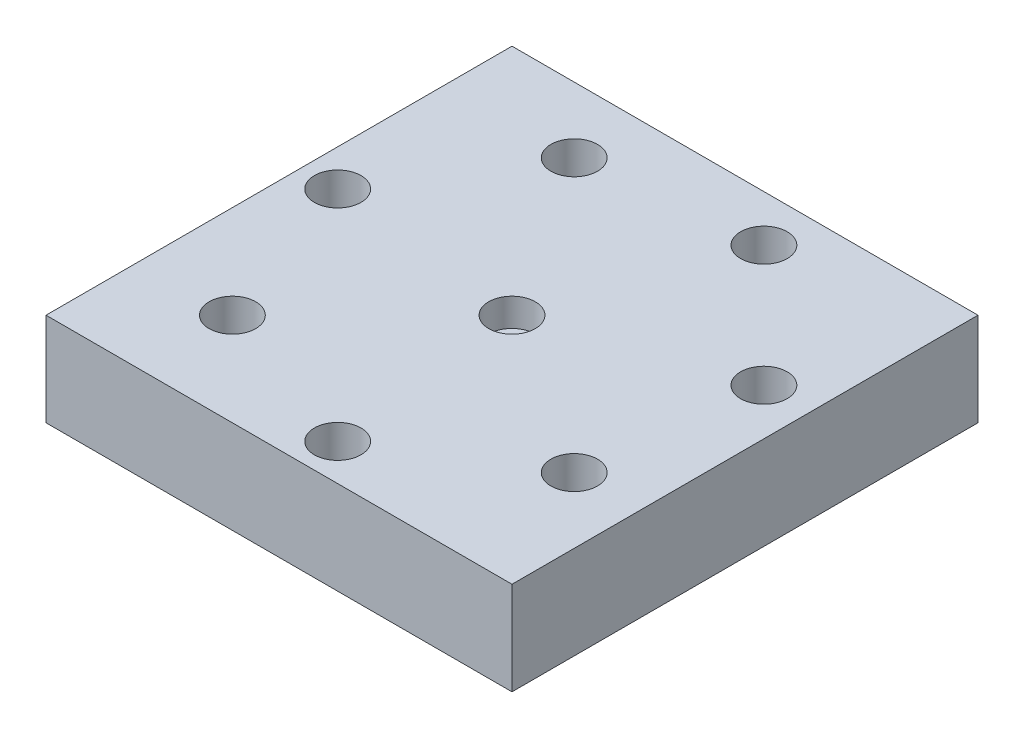
ISO-10303-21;
HEADER;
FILE_DESCRIPTION(('STEP AP214'),'2;1');
FILE_NAME('part.step','',(''),(''),'','','');
FILE_SCHEMA(('AUTOMOTIVE_DESIGN { 1 0 10303 214 1 1 1 1 }'));
ENDSEC;
DATA;
#1=APPLICATION_CONTEXT('core data for automotive mechanical design processes');
#2=APPLICATION_PROTOCOL_DEFINITION('international standard','automotive_design',2000,#1);
#3=PRODUCT_CONTEXT('',#1,'mechanical');
#4=PRODUCT('Part','Part','',(#3));
#5=PRODUCT_RELATED_PRODUCT_CATEGORY('part','',(#4));
#6=PRODUCT_DEFINITION_FORMATION('','',#4);
#7=PRODUCT_DEFINITION_CONTEXT('part definition',#1,'design');
#8=PRODUCT_DEFINITION('design','',#6,#7);
#9=PRODUCT_DEFINITION_SHAPE('','',#8);
#10=(LENGTH_UNIT() NAMED_UNIT(*) SI_UNIT(.MILLI.,.METRE.));
#11=(NAMED_UNIT(*) PLANE_ANGLE_UNIT() SI_UNIT($,.RADIAN.));
#12=(NAMED_UNIT(*) SI_UNIT($,.STERADIAN.) SOLID_ANGLE_UNIT());
#13=UNCERTAINTY_MEASURE_WITH_UNIT(LENGTH_MEASURE(1.E-05),#10,'distance_accuracy_value','');
#14=(GEOMETRIC_REPRESENTATION_CONTEXT(3) GLOBAL_UNCERTAINTY_ASSIGNED_CONTEXT((#13)) GLOBAL_UNIT_ASSIGNED_CONTEXT((#10,
#11,#12)) REPRESENTATION_CONTEXT('',''));
#15=CARTESIAN_POINT('',(0.,0.,0.));
#16=DIRECTION('',(0.,0.,1.));
#17=DIRECTION('',(1.,0.,0.));
#18=AXIS2_PLACEMENT_3D('',#15,#16,#17);
#19=CARTESIAN_POINT('',(0.,254.,0.));
#20=DIRECTION('',(0.,-1.,0.));
#21=DIRECTION('',(0.,0.,-1.));
#22=AXIS2_PLACEMENT_3D('',#19,#20,#21);
#23=PLANE('',#22);
#24=DIRECTION('',(0.,0.,-1.));
#25=VECTOR('',#24,1.);
#26=CARTESIAN_POINT('',(635.,254.,635.));
#27=LINE('',#26,#25);
#28=CARTESIAN_POINT('',(635.,254.,635.));
#29=VERTEX_POINT('',#28);
#30=CARTESIAN_POINT('',(635.,254.,-635.));
#31=VERTEX_POINT('',#30);
#32=EDGE_CURVE('E96',#29,#31,#27,.T.);
#33=ORIENTED_EDGE('',*,*,#32,.T.);
#34=DIRECTION('',(-1.,0.,0.));
#35=VECTOR('',#34,1.);
#36=CARTESIAN_POINT('',(-635.,254.,-635.));
#37=LINE('',#36,#35);
#38=CARTESIAN_POINT('',(-635.,254.,-635.));
#39=VERTEX_POINT('',#38);
#40=EDGE_CURVE('E91',#31,#39,#37,.T.);
#41=ORIENTED_EDGE('',*,*,#40,.T.);
#42=DIRECTION('',(0.,0.,1.));
#43=VECTOR('',#42,1.);
#44=CARTESIAN_POINT('',(-635.,254.,635.));
#45=LINE('',#44,#43);
#46=CARTESIAN_POINT('',(-635.,254.,635.));
#47=VERTEX_POINT('',#46);
#48=EDGE_CURVE('E94',#39,#47,#45,.T.);
#49=ORIENTED_EDGE('',*,*,#48,.T.);
#50=DIRECTION('',(1.,0.,0.));
#51=VECTOR('',#50,1.);
#52=CARTESIAN_POINT('',(-635.,254.,635.));
#53=LINE('',#52,#51);
#54=EDGE_CURVE('E61',#47,#29,#53,.T.);
#55=ORIENTED_EDGE('',*,*,#54,.T.);
#56=EDGE_LOOP('',(#33,#41,#49,#55));
#57=FACE_BOUND('',#56,.T.);
#58=CARTESIAN_POINT('',(-381.,254.,381.));
#59=DIRECTION('',(0.,1.,0.));
#60=DIRECTION('',(0.,0.,1.));
#61=AXIS2_PLACEMENT_3D('',#58,#59,#60);
#62=CIRCLE('',#61,63.5);
#63=CARTESIAN_POINT('',(-381.,254.,444.5));
#64=VERTEX_POINT('',#63);
#65=EDGE_CURVE('E111',#64,#64,#62,.T.);
#66=ORIENTED_EDGE('',*,*,#65,.F.);
#67=EDGE_LOOP('',(#66));
#68=FACE_BOUND('',#67,.T.);
#69=CARTESIAN_POINT('',(-535.427409328497,254.,-60.328180312143));
#70=DIRECTION('',(0.,1.,0.));
#71=DIRECTION('',(0.,0.,1.));
#72=AXIS2_PLACEMENT_3D('',#69,#70,#71);
#73=CIRCLE('',#72,63.5);
#74=CARTESIAN_POINT('',(-535.427409328497,254.,3.17181968785697));
#75=VERTEX_POINT('',#74);
#76=EDGE_CURVE('E127',#75,#75,#73,.T.);
#77=ORIENTED_EDGE('',*,*,#76,.F.);
#78=EDGE_LOOP('',(#77));
#79=FACE_BOUND('',#78,.T.);
#80=CARTESIAN_POINT('',(-286.667058703917,254.,-456.228010378632));
#81=DIRECTION('',(0.,1.,0.));
#82=DIRECTION('',(0.,0.,1.));
#83=AXIS2_PLACEMENT_3D('',#80,#81,#82);
#84=CIRCLE('',#83,63.5);
#85=CARTESIAN_POINT('',(-286.667058703917,254.,-392.728010378632));
#86=VERTEX_POINT('',#85);
#87=EDGE_CURVE('E141',#86,#86,#84,.T.);
#88=ORIENTED_EDGE('',*,*,#87,.F.);
#89=EDGE_LOOP('',(#88));
#90=FACE_BOUND('',#89,.T.);
#91=CARTESIAN_POINT('',(177.959434067035,254.,-508.57884327461));
#92=DIRECTION('',(0.,1.,0.));
#93=DIRECTION('',(0.,0.,1.));
#94=AXIS2_PLACEMENT_3D('',#91,#92,#93);
#95=CIRCLE('',#94,63.5);
#96=CARTESIAN_POINT('',(177.959434067035,254.,-445.07884327461));
#97=VERTEX_POINT('',#96);
#98=EDGE_CURVE('E142',#97,#97,#95,.T.);
#99=ORIENTED_EDGE('',*,*,#98,.F.);
#100=EDGE_LOOP('',(#99));
#101=FACE_BOUND('',#100,.T.);
#102=CARTESIAN_POINT('',(508.578843274613,254.,-177.959434067028));
#103=DIRECTION('',(0.,1.,0.));
#104=DIRECTION('',(0.,0.,1.));
#105=AXIS2_PLACEMENT_3D('',#102,#103,#104);
#106=CIRCLE('',#105,63.5);
#107=CARTESIAN_POINT('',(508.578843274613,254.,-114.459434067028));
#108=VERTEX_POINT('',#107);
#109=EDGE_CURVE('E164',#108,#108,#106,.T.);
#110=ORIENTED_EDGE('',*,*,#109,.F.);
#111=EDGE_LOOP('',(#110));
#112=FACE_BOUND('',#111,.T.);
#113=CARTESIAN_POINT('',(456.228010378628,254.,286.667058703923));
#114=DIRECTION('',(0.,1.,0.));
#115=DIRECTION('',(0.,0.,1.));
#116=AXIS2_PLACEMENT_3D('',#113,#114,#115);
#117=CIRCLE('',#116,63.5);
#118=CARTESIAN_POINT('',(456.228010378628,254.,350.167058703923));
#119=VERTEX_POINT('',#118);
#120=EDGE_CURVE('E173',#119,#119,#117,.T.);
#121=ORIENTED_EDGE('',*,*,#120,.F.);
#122=EDGE_LOOP('',(#121));
#123=FACE_BOUND('',#122,.T.);
#124=CARTESIAN_POINT('',(60.3281803121352,254.,535.427409328498));
#125=DIRECTION('',(0.,1.,0.));
#126=DIRECTION('',(0.,0.,1.));
#127=AXIS2_PLACEMENT_3D('',#124,#125,#126);
#128=CIRCLE('',#127,63.5);
#129=CARTESIAN_POINT('',(60.3281803121352,254.,598.927409328498));
#130=VERTEX_POINT('',#129);
#131=EDGE_CURVE('E174',#130,#130,#128,.T.);
#132=ORIENTED_EDGE('',*,*,#131,.F.);
#133=EDGE_LOOP('',(#132));
#134=FACE_BOUND('',#133,.T.);
#135=CARTESIAN_POINT('',(0.,254.,0.));
#136=DIRECTION('',(0.,1.,0.));
#137=DIRECTION('',(0.,0.,1.));
#138=AXIS2_PLACEMENT_3D('',#135,#136,#137);
#139=CIRCLE('',#138,63.5);
#140=CARTESIAN_POINT('',(0.,254.,63.5));
#141=VERTEX_POINT('',#140);
#142=EDGE_CURVE('E197',#141,#141,#139,.T.);
#143=ORIENTED_EDGE('',*,*,#142,.F.);
#144=EDGE_LOOP('',(#143));
#145=FACE_BOUND('',#144,.T.);
#146=ADVANCED_FACE('F44',(#57,#68,#79,#90,#101,#112,#123,#134,#145),#23,.F.);
#147=CARTESIAN_POINT('',(0.,0.,0.));
#148=DIRECTION('',(0.,-1.,0.));
#149=DIRECTION('',(0.,0.,-1.));
#150=AXIS2_PLACEMENT_3D('',#147,#148,#149);
#151=PLANE('',#150);
#152=CARTESIAN_POINT('',(0.,0.,0.));
#153=DIRECTION('',(0.,1.,0.));
#154=DIRECTION('',(0.,0.,1.));
#155=AXIS2_PLACEMENT_3D('',#152,#153,#154);
#156=CIRCLE('',#155,38.0999999999999);
#157=CARTESIAN_POINT('',(0.,0.,38.0999999999999));
#158=VERTEX_POINT('',#157);
#159=EDGE_CURVE('E207',#158,#158,#156,.T.);
#160=ORIENTED_EDGE('',*,*,#159,.T.);
#161=EDGE_LOOP('',(#160));
#162=FACE_BOUND('',#161,.T.);
#163=CARTESIAN_POINT('',(456.228010378628,0.,286.667058703923));
#164=DIRECTION('',(0.,1.,0.));
#165=DIRECTION('',(0.,0.,1.));
#166=AXIS2_PLACEMENT_3D('',#163,#164,#165);
#167=CIRCLE('',#166,63.5);
#168=CARTESIAN_POINT('',(456.228010378628,0.,350.167058703923));
#169=VERTEX_POINT('',#168);
#170=EDGE_CURVE('E169',#169,#169,#167,.T.);
#171=ORIENTED_EDGE('',*,*,#170,.T.);
#172=EDGE_LOOP('',(#171));
#173=FACE_BOUND('',#172,.T.);
#174=CARTESIAN_POINT('',(177.959434067035,0.,-508.57884327461));
#175=DIRECTION('',(0.,1.,0.));
#176=DIRECTION('',(0.,0.,1.));
#177=AXIS2_PLACEMENT_3D('',#174,#175,#176);
#178=CIRCLE('',#177,63.5);
#179=CARTESIAN_POINT('',(177.959434067035,0.,-445.07884327461));
#180=VERTEX_POINT('',#179);
#181=EDGE_CURVE('E159',#180,#180,#178,.T.);
#182=ORIENTED_EDGE('',*,*,#181,.T.);
#183=EDGE_LOOP('',(#182));
#184=FACE_BOUND('',#183,.T.);
#185=CARTESIAN_POINT('',(-535.427409328497,0.,-60.328180312143));
#186=DIRECTION('',(0.,1.,0.));
#187=DIRECTION('',(0.,0.,1.));
#188=AXIS2_PLACEMENT_3D('',#185,#186,#187);
#189=CIRCLE('',#188,63.5);
#190=CARTESIAN_POINT('',(-535.427409328497,0.,3.17181968785697));
#191=VERTEX_POINT('',#190);
#192=EDGE_CURVE('E147',#191,#191,#189,.T.);
#193=ORIENTED_EDGE('',*,*,#192,.T.);
#194=EDGE_LOOP('',(#193));
#195=FACE_BOUND('',#194,.T.);
#196=DIRECTION('',(0.,0.,-1.));
#197=VECTOR('',#196,1.);
#198=CARTESIAN_POINT('',(635.,0.,635.));
#199=LINE('',#198,#197);
#200=CARTESIAN_POINT('',(635.,0.,635.));
#201=VERTEX_POINT('',#200);
#202=CARTESIAN_POINT('',(635.,0.,-635.));
#203=VERTEX_POINT('',#202);
#204=EDGE_CURVE('E108',#201,#203,#199,.T.);
#205=ORIENTED_EDGE('',*,*,#204,.F.);
#206=DIRECTION('',(1.,0.,0.));
#207=VECTOR('',#206,1.);
#208=CARTESIAN_POINT('',(-635.,0.,635.));
#209=LINE('',#208,#207);
#210=CARTESIAN_POINT('',(-635.,0.,635.));
#211=VERTEX_POINT('',#210);
#212=EDGE_CURVE('E84',#211,#201,#209,.T.);
#213=ORIENTED_EDGE('',*,*,#212,.F.);
#214=DIRECTION('',(0.,0.,1.));
#215=VECTOR('',#214,1.);
#216=CARTESIAN_POINT('',(-635.,0.,635.));
#217=LINE('',#216,#215);
#218=CARTESIAN_POINT('',(-635.,0.,-635.));
#219=VERTEX_POINT('',#218);
#220=EDGE_CURVE('E78',#219,#211,#217,.T.);
#221=ORIENTED_EDGE('',*,*,#220,.F.);
#222=DIRECTION('',(-1.,0.,0.));
#223=VECTOR('',#222,1.);
#224=CARTESIAN_POINT('',(-635.,0.,-635.));
#225=LINE('',#224,#223);
#226=EDGE_CURVE('E100',#203,#219,#225,.T.);
#227=ORIENTED_EDGE('',*,*,#226,.F.);
#228=EDGE_LOOP('',(#205,#213,#221,#227));
#229=FACE_BOUND('',#228,.T.);
#230=CARTESIAN_POINT('',(-381.,0.,381.));
#231=DIRECTION('',(0.,1.,0.));
#232=DIRECTION('',(0.,0.,1.));
#233=AXIS2_PLACEMENT_3D('',#230,#231,#232);
#234=CIRCLE('',#233,63.5);
#235=CARTESIAN_POINT('',(-381.,0.,444.5));
#236=VERTEX_POINT('',#235);
#237=EDGE_CURVE('E123',#236,#236,#234,.T.);
#238=ORIENTED_EDGE('',*,*,#237,.T.);
#239=EDGE_LOOP('',(#238));
#240=FACE_BOUND('',#239,.T.);
#241=CARTESIAN_POINT('',(-286.667058703917,0.,-456.228010378632));
#242=DIRECTION('',(0.,1.,0.));
#243=DIRECTION('',(0.,0.,1.));
#244=AXIS2_PLACEMENT_3D('',#241,#242,#243);
#245=CIRCLE('',#244,63.5);
#246=CARTESIAN_POINT('',(-286.667058703917,0.,-392.728010378632));
#247=VERTEX_POINT('',#246);
#248=EDGE_CURVE('E136',#247,#247,#245,.T.);
#249=ORIENTED_EDGE('',*,*,#248,.T.);
#250=EDGE_LOOP('',(#249));
#251=FACE_BOUND('',#250,.T.);
#252=CARTESIAN_POINT('',(508.578843274613,0.,-177.959434067028));
#253=DIRECTION('',(0.,1.,0.));
#254=DIRECTION('',(0.,0.,1.));
#255=AXIS2_PLACEMENT_3D('',#252,#253,#254);
#256=CIRCLE('',#255,63.5);
#257=CARTESIAN_POINT('',(508.578843274613,0.,-114.459434067028));
#258=VERTEX_POINT('',#257);
#259=EDGE_CURVE('E160',#258,#258,#256,.T.);
#260=ORIENTED_EDGE('',*,*,#259,.T.);
#261=EDGE_LOOP('',(#260));
#262=FACE_BOUND('',#261,.T.);
#263=CARTESIAN_POINT('',(60.3281803121352,0.,535.427409328498));
#264=DIRECTION('',(0.,1.,0.));
#265=DIRECTION('',(0.,0.,1.));
#266=AXIS2_PLACEMENT_3D('',#263,#264,#265);
#267=CIRCLE('',#266,63.5);
#268=CARTESIAN_POINT('',(60.3281803121352,0.,598.927409328498));
#269=VERTEX_POINT('',#268);
#270=EDGE_CURVE('E209',#269,#269,#267,.T.);
#271=ORIENTED_EDGE('',*,*,#270,.T.);
#272=EDGE_LOOP('',(#271));
#273=FACE_BOUND('',#272,.T.);
#274=ADVANCED_FACE('F119',(#162,#173,#184,#195,#229,#240,#251,#262,#273),#151,.T.);
#275=CARTESIAN_POINT('',(635.,254.,635.));
#276=DIRECTION('',(-1.,0.,0.));
#277=DIRECTION('',(0.,0.,1.));
#278=AXIS2_PLACEMENT_3D('',#275,#276,#277);
#279=PLANE('',#278);
#280=ORIENTED_EDGE('',*,*,#204,.T.);
#281=DIRECTION('',(0.,-1.,0.));
#282=VECTOR('',#281,1.);
#283=CARTESIAN_POINT('',(635.,254.,-635.));
#284=LINE('',#283,#282);
#285=EDGE_CURVE('E12',#31,#203,#284,.T.);
#286=ORIENTED_EDGE('',*,*,#285,.F.);
#287=ORIENTED_EDGE('',*,*,#32,.F.);
#288=DIRECTION('',(0.,-1.,0.));
#289=VECTOR('',#288,1.);
#290=CARTESIAN_POINT('',(635.,254.,635.));
#291=LINE('',#290,#289);
#292=EDGE_CURVE('E104',#29,#201,#291,.T.);
#293=ORIENTED_EDGE('',*,*,#292,.T.);
#294=EDGE_LOOP('',(#280,#286,#287,#293));
#295=FACE_BOUND('',#294,.T.);
#296=ADVANCED_FACE('F46',(#295),#279,.F.);
#297=CARTESIAN_POINT('',(-635.,254.,-635.));
#298=DIRECTION('',(0.,0.,1.));
#299=DIRECTION('',(1.,0.,0.));
#300=AXIS2_PLACEMENT_3D('',#297,#298,#299);
#301=PLANE('',#300);
#302=ORIENTED_EDGE('',*,*,#226,.T.);
#303=DIRECTION('',(0.,-1.,0.));
#304=VECTOR('',#303,1.);
#305=CARTESIAN_POINT('',(-635.,254.,-635.));
#306=LINE('',#305,#304);
#307=EDGE_CURVE('E53',#39,#219,#306,.T.);
#308=ORIENTED_EDGE('',*,*,#307,.F.);
#309=ORIENTED_EDGE('',*,*,#40,.F.);
#310=ORIENTED_EDGE('',*,*,#285,.T.);
#311=EDGE_LOOP('',(#302,#308,#309,#310));
#312=FACE_BOUND('',#311,.T.);
#313=ADVANCED_FACE('F99',(#312),#301,.F.);
#314=CARTESIAN_POINT('',(-635.,254.,635.));
#315=DIRECTION('',(1.,0.,0.));
#316=DIRECTION('',(0.,0.,-1.));
#317=AXIS2_PLACEMENT_3D('',#314,#315,#316);
#318=PLANE('',#317);
#319=ORIENTED_EDGE('',*,*,#220,.T.);
#320=DIRECTION('',(0.,-1.,0.));
#321=VECTOR('',#320,1.);
#322=CARTESIAN_POINT('',(-635.,254.,635.));
#323=LINE('',#322,#321);
#324=EDGE_CURVE('E101',#47,#211,#323,.T.);
#325=ORIENTED_EDGE('',*,*,#324,.F.);
#326=ORIENTED_EDGE('',*,*,#48,.F.);
#327=ORIENTED_EDGE('',*,*,#307,.T.);
#328=EDGE_LOOP('',(#319,#325,#326,#327));
#329=FACE_BOUND('',#328,.T.);
#330=ADVANCED_FACE('F102',(#329),#318,.F.);
#331=CARTESIAN_POINT('',(-635.,254.,635.));
#332=DIRECTION('',(0.,0.,-1.));
#333=DIRECTION('',(-1.,0.,0.));
#334=AXIS2_PLACEMENT_3D('',#331,#332,#333);
#335=PLANE('',#334);
#336=ORIENTED_EDGE('',*,*,#212,.T.);
#337=ORIENTED_EDGE('',*,*,#292,.F.);
#338=ORIENTED_EDGE('',*,*,#54,.F.);
#339=ORIENTED_EDGE('',*,*,#324,.T.);
#340=EDGE_LOOP('',(#336,#337,#338,#339));
#341=FACE_BOUND('',#340,.T.);
#342=ADVANCED_FACE('F116',(#341),#335,.F.);
#343=CARTESIAN_POINT('',(-381.,254.,381.));
#344=DIRECTION('',(0.,-1.,0.));
#345=DIRECTION('',(0.,0.,-1.));
#346=AXIS2_PLACEMENT_3D('',#343,#344,#345);
#347=CYLINDRICAL_SURFACE('',#346,63.5);
#348=ORIENTED_EDGE('',*,*,#65,.T.);
#349=EDGE_LOOP('',(#348));
#350=FACE_BOUND('',#349,.T.);
#351=ORIENTED_EDGE('',*,*,#237,.F.);
#352=EDGE_LOOP('',(#351));
#353=FACE_BOUND('',#352,.T.);
#354=ADVANCED_FACE('F245',(#350,#353),#347,.F.);
#355=CARTESIAN_POINT('',(-535.427409328497,254.,-60.328180312143));
#356=DIRECTION('',(0.,-1.,0.));
#357=DIRECTION('',(0.,0.,-1.));
#358=AXIS2_PLACEMENT_3D('',#355,#356,#357);
#359=CYLINDRICAL_SURFACE('',#358,63.5);
#360=ORIENTED_EDGE('',*,*,#76,.T.);
#361=EDGE_LOOP('',(#360));
#362=FACE_BOUND('',#361,.T.);
#363=ORIENTED_EDGE('',*,*,#192,.F.);
#364=EDGE_LOOP('',(#363));
#365=FACE_BOUND('',#364,.T.);
#366=ADVANCED_FACE('F241',(#362,#365),#359,.F.);
#367=CARTESIAN_POINT('',(-286.667058703917,254.,-456.228010378632));
#368=DIRECTION('',(0.,-1.,0.));
#369=DIRECTION('',(0.,0.,-1.));
#370=AXIS2_PLACEMENT_3D('',#367,#368,#369);
#371=CYLINDRICAL_SURFACE('',#370,63.5);
#372=ORIENTED_EDGE('',*,*,#87,.T.);
#373=EDGE_LOOP('',(#372));
#374=FACE_BOUND('',#373,.T.);
#375=ORIENTED_EDGE('',*,*,#248,.F.);
#376=EDGE_LOOP('',(#375));
#377=FACE_BOUND('',#376,.T.);
#378=ADVANCED_FACE('F237',(#374,#377),#371,.F.);
#379=CARTESIAN_POINT('',(177.959434067035,254.,-508.57884327461));
#380=DIRECTION('',(0.,-1.,0.));
#381=DIRECTION('',(0.,0.,-1.));
#382=AXIS2_PLACEMENT_3D('',#379,#380,#381);
#383=CYLINDRICAL_SURFACE('',#382,63.5);
#384=ORIENTED_EDGE('',*,*,#98,.T.);
#385=EDGE_LOOP('',(#384));
#386=FACE_BOUND('',#385,.T.);
#387=ORIENTED_EDGE('',*,*,#181,.F.);
#388=EDGE_LOOP('',(#387));
#389=FACE_BOUND('',#388,.T.);
#390=ADVANCED_FACE('F234',(#386,#389),#383,.F.);
#391=CARTESIAN_POINT('',(508.578843274613,254.,-177.959434067028));
#392=DIRECTION('',(0.,-1.,0.));
#393=DIRECTION('',(0.,0.,-1.));
#394=AXIS2_PLACEMENT_3D('',#391,#392,#393);
#395=CYLINDRICAL_SURFACE('',#394,63.5);
#396=ORIENTED_EDGE('',*,*,#109,.T.);
#397=EDGE_LOOP('',(#396));
#398=FACE_BOUND('',#397,.T.);
#399=ORIENTED_EDGE('',*,*,#259,.F.);
#400=EDGE_LOOP('',(#399));
#401=FACE_BOUND('',#400,.T.);
#402=ADVANCED_FACE('F228',(#398,#401),#395,.F.);
#403=CARTESIAN_POINT('',(456.228010378628,254.,286.667058703923));
#404=DIRECTION('',(0.,-1.,0.));
#405=DIRECTION('',(0.,0.,-1.));
#406=AXIS2_PLACEMENT_3D('',#403,#404,#405);
#407=CYLINDRICAL_SURFACE('',#406,63.5);
#408=ORIENTED_EDGE('',*,*,#120,.T.);
#409=EDGE_LOOP('',(#408));
#410=FACE_BOUND('',#409,.T.);
#411=ORIENTED_EDGE('',*,*,#170,.F.);
#412=EDGE_LOOP('',(#411));
#413=FACE_BOUND('',#412,.T.);
#414=ADVANCED_FACE('F186',(#410,#413),#407,.F.);
#415=CARTESIAN_POINT('',(60.3281803121352,254.,535.427409328498));
#416=DIRECTION('',(0.,-1.,0.));
#417=DIRECTION('',(0.,0.,-1.));
#418=AXIS2_PLACEMENT_3D('',#415,#416,#417);
#419=CYLINDRICAL_SURFACE('',#418,63.5);
#420=ORIENTED_EDGE('',*,*,#131,.T.);
#421=EDGE_LOOP('',(#420));
#422=FACE_BOUND('',#421,.T.);
#423=ORIENTED_EDGE('',*,*,#270,.F.);
#424=EDGE_LOOP('',(#423));
#425=FACE_BOUND('',#424,.T.);
#426=ADVANCED_FACE('F216',(#422,#425),#419,.F.);
#427=CARTESIAN_POINT('',(0.,254.,0.));
#428=DIRECTION('',(0.,1.,0.));
#429=DIRECTION('',(0.,0.,1.));
#430=AXIS2_PLACEMENT_3D('',#427,#428,#429);
#431=CYLINDRICAL_SURFACE('',#430,38.1);
#432=ORIENTED_EDGE('',*,*,#159,.F.);
#433=EDGE_LOOP('',(#432));
#434=FACE_BOUND('',#433,.T.);
#435=CARTESIAN_POINT('',(0.,177.8,0.));
#436=DIRECTION('',(0.,1.,0.));
#437=DIRECTION('',(0.,0.,1.));
#438=AXIS2_PLACEMENT_3D('',#435,#436,#437);
#439=CIRCLE('',#438,38.1);
#440=CARTESIAN_POINT('',(0.,177.8,38.1));
#441=VERTEX_POINT('',#440);
#442=EDGE_CURVE('E202',#441,#441,#439,.T.);
#443=ORIENTED_EDGE('',*,*,#442,.T.);
#444=EDGE_LOOP('',(#443));
#445=FACE_BOUND('',#444,.T.);
#446=ADVANCED_FACE('F218',(#434,#445),#431,.F.);
#447=CARTESIAN_POINT('',(38.1,177.8,0.));
#448=DIRECTION('',(0.,-1.,0.));
#449=DIRECTION('',(0.,0.,-1.));
#450=AXIS2_PLACEMENT_3D('',#447,#448,#449);
#451=PLANE('',#450);
#452=ORIENTED_EDGE('',*,*,#442,.F.);
#453=EDGE_LOOP('',(#452));
#454=FACE_BOUND('',#453,.T.);
#455=CARTESIAN_POINT('',(0.,177.8,0.));
#456=DIRECTION('',(0.,1.,0.));
#457=DIRECTION('',(0.,0.,1.));
#458=AXIS2_PLACEMENT_3D('',#455,#456,#457);
#459=CIRCLE('',#458,63.5);
#460=CARTESIAN_POINT('',(0.,177.8,63.5));
#461=VERTEX_POINT('',#460);
#462=EDGE_CURVE('E199',#461,#461,#459,.T.);
#463=ORIENTED_EDGE('',*,*,#462,.T.);
#464=EDGE_LOOP('',(#463));
#465=FACE_BOUND('',#464,.T.);
#466=ADVANCED_FACE('F225',(#454,#465),#451,.F.);
#467=CARTESIAN_POINT('',(0.,254.,0.));
#468=DIRECTION('',(0.,1.,0.));
#469=DIRECTION('',(0.,0.,1.));
#470=AXIS2_PLACEMENT_3D('',#467,#468,#469);
#471=CYLINDRICAL_SURFACE('',#470,63.5);
#472=ORIENTED_EDGE('',*,*,#462,.F.);
#473=EDGE_LOOP('',(#472));
#474=FACE_BOUND('',#473,.T.);
#475=ORIENTED_EDGE('',*,*,#142,.T.);
#476=EDGE_LOOP('',(#475));
#477=FACE_BOUND('',#476,.T.);
#478=ADVANCED_FACE('F345',(#474,#477),#471,.F.);
#479=CLOSED_SHELL('',(#146,#274,#296,#313,#330,#342,#354,#366,#378,#390,#402,#414,#426,#446,
#466,#478));
#480=MANIFOLD_SOLID_BREP('B2',#479);
#481=ADVANCED_BREP_SHAPE_REPRESENTATION('',(#18,#480),#14);
#482=SHAPE_DEFINITION_REPRESENTATION(#9,#481);
ENDSEC;
END-ISO-10303-21;
